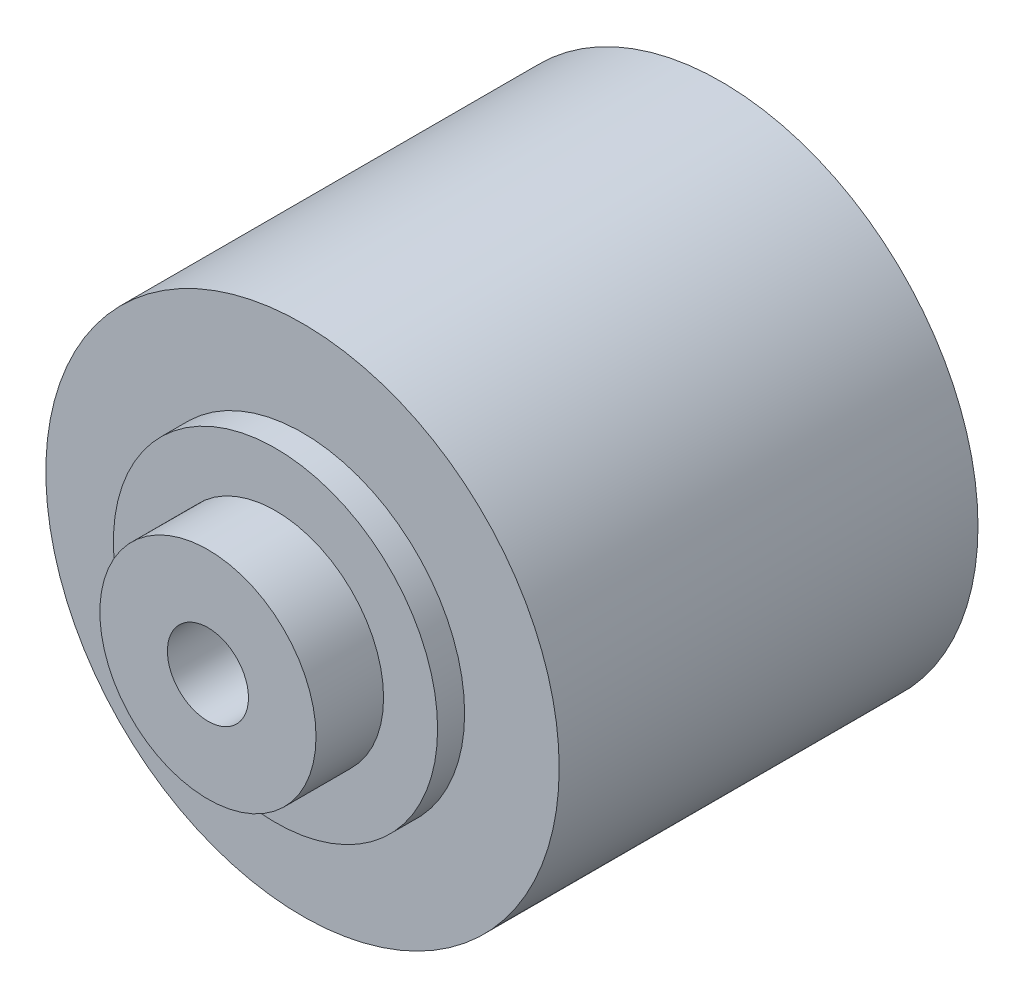
ISO-10303-21;
HEADER;
FILE_DESCRIPTION(('STEP AP214'),'2;1');
FILE_NAME('part.step','',(''),(''),'','','');
FILE_SCHEMA(('AUTOMOTIVE_DESIGN { 1 0 10303 214 1 1 1 1 }'));
ENDSEC;
DATA;
#1=APPLICATION_CONTEXT('core data for automotive mechanical design processes');
#2=APPLICATION_PROTOCOL_DEFINITION('international standard','automotive_design',2000,#1);
#3=PRODUCT_CONTEXT('',#1,'mechanical');
#4=PRODUCT('Part','Part','',(#3));
#5=PRODUCT_RELATED_PRODUCT_CATEGORY('part','',(#4));
#6=PRODUCT_DEFINITION_FORMATION('','',#4);
#7=PRODUCT_DEFINITION_CONTEXT('part definition',#1,'design');
#8=PRODUCT_DEFINITION('design','',#6,#7);
#9=PRODUCT_DEFINITION_SHAPE('','',#8);
#10=(LENGTH_UNIT() NAMED_UNIT(*) SI_UNIT(.MILLI.,.METRE.));
#11=(NAMED_UNIT(*) PLANE_ANGLE_UNIT() SI_UNIT($,.RADIAN.));
#12=(NAMED_UNIT(*) SI_UNIT($,.STERADIAN.) SOLID_ANGLE_UNIT());
#13=UNCERTAINTY_MEASURE_WITH_UNIT(LENGTH_MEASURE(1.E-05),#10,'distance_accuracy_value','');
#14=(GEOMETRIC_REPRESENTATION_CONTEXT(3) GLOBAL_UNCERTAINTY_ASSIGNED_CONTEXT((#13)) GLOBAL_UNIT_ASSIGNED_CONTEXT((#10,
#11,#12)) REPRESENTATION_CONTEXT('',''));
#15=CARTESIAN_POINT('',(0.,0.,0.));
#16=DIRECTION('',(0.,0.,1.));
#17=DIRECTION('',(1.,0.,0.));
#18=AXIS2_PLACEMENT_3D('',#15,#16,#17);
#19=CARTESIAN_POINT('',(0.,0.,0.));
#20=DIRECTION('',(0.,0.,1.));
#21=DIRECTION('',(1.,0.,0.));
#22=AXIS2_PLACEMENT_3D('',#19,#20,#21);
#23=PLANE('',#22);
#24=CARTESIAN_POINT('',(0.,0.,0.));
#25=DIRECTION('',(0.,0.,1.));
#26=DIRECTION('',(1.,0.,0.));
#27=AXIS2_PLACEMENT_3D('',#24,#25,#26);
#28=CIRCLE('',#27,19.);
#29=CARTESIAN_POINT('',(19.,0.,0.));
#30=VERTEX_POINT('',#29);
#31=EDGE_CURVE('E48',#30,#30,#28,.T.);
#32=ORIENTED_EDGE('',*,*,#31,.F.);
#33=EDGE_LOOP('',(#32));
#34=FACE_BOUND('',#33,.T.);
#35=CARTESIAN_POINT('',(0.,0.,0.));
#36=DIRECTION('',(0.,0.,1.));
#37=DIRECTION('',(1.,0.,0.));
#38=AXIS2_PLACEMENT_3D('',#35,#36,#37);
#39=CIRCLE('',#38,10.);
#40=CARTESIAN_POINT('',(10.,0.,0.));
#41=VERTEX_POINT('',#40);
#42=EDGE_CURVE('E10',#41,#41,#39,.F.);
#43=ORIENTED_EDGE('',*,*,#42,.F.);
#44=EDGE_LOOP('',(#43));
#45=FACE_BOUND('',#44,.T.);
#46=ADVANCED_FACE('F32',(#34,#45),#23,.F.);
#47=CARTESIAN_POINT('',(0.,0.,31.));
#48=DIRECTION('',(0.,0.,-1.));
#49=DIRECTION('',(-1.,0.,0.));
#50=AXIS2_PLACEMENT_3D('',#47,#48,#49);
#51=CYLINDRICAL_SURFACE('',#50,19.);
#52=CARTESIAN_POINT('',(0.,0.,31.));
#53=DIRECTION('',(0.,0.,1.));
#54=DIRECTION('',(1.,0.,0.));
#55=AXIS2_PLACEMENT_3D('',#52,#53,#54);
#56=CIRCLE('',#55,19.);
#57=CARTESIAN_POINT('',(19.,0.,31.));
#58=VERTEX_POINT('',#57);
#59=EDGE_CURVE('E43',#58,#58,#56,.T.);
#60=ORIENTED_EDGE('',*,*,#59,.F.);
#61=EDGE_LOOP('',(#60));
#62=FACE_BOUND('',#61,.T.);
#63=ORIENTED_EDGE('',*,*,#31,.T.);
#64=EDGE_LOOP('',(#63));
#65=FACE_BOUND('',#64,.T.);
#66=ADVANCED_FACE('F34',(#62,#65),#51,.T.);
#67=CARTESIAN_POINT('',(0.,0.,31.));
#68=DIRECTION('',(0.,0.,1.));
#69=DIRECTION('',(1.,0.,0.));
#70=AXIS2_PLACEMENT_3D('',#67,#68,#69);
#71=PLANE('',#70);
#72=CARTESIAN_POINT('',(0.,0.,31.));
#73=DIRECTION('',(0.,0.,1.));
#74=DIRECTION('',(1.,0.,0.));
#75=AXIS2_PLACEMENT_3D('',#72,#73,#74);
#76=CIRCLE('',#75,12.);
#77=CARTESIAN_POINT('',(12.,0.,31.));
#78=VERTEX_POINT('',#77);
#79=EDGE_CURVE('E61',#78,#78,#76,.T.);
#80=ORIENTED_EDGE('',*,*,#79,.F.);
#81=EDGE_LOOP('',(#80));
#82=FACE_BOUND('',#81,.T.);
#83=ORIENTED_EDGE('',*,*,#59,.T.);
#84=EDGE_LOOP('',(#83));
#85=FACE_BOUND('',#84,.T.);
#86=ADVANCED_FACE('F86',(#82,#85),#71,.T.);
#87=CARTESIAN_POINT('',(0.,0.,33.));
#88=DIRECTION('',(0.,0.,1.));
#89=DIRECTION('',(1.,0.,0.));
#90=AXIS2_PLACEMENT_3D('',#87,#88,#89);
#91=PLANE('',#90);
#92=CARTESIAN_POINT('',(0.,0.,33.));
#93=DIRECTION('',(0.,0.,1.));
#94=DIRECTION('',(1.,0.,0.));
#95=AXIS2_PLACEMENT_3D('',#92,#93,#94);
#96=CIRCLE('',#95,12.);
#97=CARTESIAN_POINT('',(12.,0.,33.));
#98=VERTEX_POINT('',#97);
#99=EDGE_CURVE('E54',#98,#98,#96,.T.);
#100=ORIENTED_EDGE('',*,*,#99,.T.);
#101=EDGE_LOOP('',(#100));
#102=FACE_BOUND('',#101,.T.);
#103=CARTESIAN_POINT('',(0.,0.,33.));
#104=DIRECTION('',(0.,0.,1.));
#105=DIRECTION('',(1.,0.,0.));
#106=AXIS2_PLACEMENT_3D('',#103,#104,#105);
#107=CIRCLE('',#106,8.);
#108=CARTESIAN_POINT('',(8.,0.,33.));
#109=VERTEX_POINT('',#108);
#110=EDGE_CURVE('E53',#109,#109,#107,.T.);
#111=ORIENTED_EDGE('',*,*,#110,.F.);
#112=EDGE_LOOP('',(#111));
#113=FACE_BOUND('',#112,.T.);
#114=ADVANCED_FACE('F91',(#102,#113),#91,.T.);
#115=CARTESIAN_POINT('',(0.,0.,33.));
#116=DIRECTION('',(0.,0.,-1.));
#117=DIRECTION('',(-1.,0.,0.));
#118=AXIS2_PLACEMENT_3D('',#115,#116,#117);
#119=CYLINDRICAL_SURFACE('',#118,12.);
#120=ORIENTED_EDGE('',*,*,#99,.F.);
#121=EDGE_LOOP('',(#120));
#122=FACE_BOUND('',#121,.T.);
#123=ORIENTED_EDGE('',*,*,#79,.T.);
#124=EDGE_LOOP('',(#123));
#125=FACE_BOUND('',#124,.T.);
#126=ADVANCED_FACE('F97',(#122,#125),#119,.T.);
#127=CARTESIAN_POINT('',(0.,0.,38.));
#128=DIRECTION('',(0.,0.,-1.));
#129=DIRECTION('',(-1.,0.,0.));
#130=AXIS2_PLACEMENT_3D('',#127,#128,#129);
#131=CYLINDRICAL_SURFACE('',#130,8.);
#132=ORIENTED_EDGE('',*,*,#110,.T.);
#133=EDGE_LOOP('',(#132));
#134=FACE_BOUND('',#133,.T.);
#135=CARTESIAN_POINT('',(0.,0.,38.));
#136=DIRECTION('',(0.,0.,1.));
#137=DIRECTION('',(1.,0.,0.));
#138=AXIS2_PLACEMENT_3D('',#135,#136,#137);
#139=CIRCLE('',#138,8.);
#140=CARTESIAN_POINT('',(8.,0.,38.));
#141=VERTEX_POINT('',#140);
#142=EDGE_CURVE('E73',#141,#141,#139,.T.);
#143=ORIENTED_EDGE('',*,*,#142,.F.);
#144=EDGE_LOOP('',(#143));
#145=FACE_BOUND('',#144,.T.);
#146=ADVANCED_FACE('F93',(#134,#145),#131,.T.);
#147=CARTESIAN_POINT('',(0.,0.,38.));
#148=DIRECTION('',(0.,0.,1.));
#149=DIRECTION('',(1.,0.,0.));
#150=AXIS2_PLACEMENT_3D('',#147,#148,#149);
#151=PLANE('',#150);
#152=CARTESIAN_POINT('',(0.,0.,38.));
#153=DIRECTION('',(0.,0.,1.));
#154=DIRECTION('',(1.,0.,0.));
#155=AXIS2_PLACEMENT_3D('',#152,#153,#154);
#156=CIRCLE('',#155,3.);
#157=CARTESIAN_POINT('',(3.,0.,38.));
#158=VERTEX_POINT('',#157);
#159=EDGE_CURVE('E58',#158,#158,#156,.T.);
#160=ORIENTED_EDGE('',*,*,#159,.F.);
#161=EDGE_LOOP('',(#160));
#162=FACE_BOUND('',#161,.T.);
#163=ORIENTED_EDGE('',*,*,#142,.T.);
#164=EDGE_LOOP('',(#163));
#165=FACE_BOUND('',#164,.T.);
#166=ADVANCED_FACE('F96',(#162,#165),#151,.T.);
#167=CARTESIAN_POINT('',(0.,0.,0.));
#168=DIRECTION('',(0.,0.,1.));
#169=DIRECTION('',(1.,0.,0.));
#170=AXIS2_PLACEMENT_3D('',#167,#168,#169);
#171=CYLINDRICAL_SURFACE('',#170,3.);
#172=CARTESIAN_POINT('',(0.,0.,33.));
#173=DIRECTION('',(0.,0.,1.));
#174=DIRECTION('',(1.,0.,0.));
#175=AXIS2_PLACEMENT_3D('',#172,#173,#174);
#176=CIRCLE('',#175,3.);
#177=CARTESIAN_POINT('',(3.,0.,33.));
#178=VERTEX_POINT('',#177);
#179=EDGE_CURVE('E51',#178,#178,#176,.F.);
#180=ORIENTED_EDGE('',*,*,#179,.T.);
#181=EDGE_LOOP('',(#180));
#182=FACE_BOUND('',#181,.T.);
#183=ORIENTED_EDGE('',*,*,#159,.T.);
#184=EDGE_LOOP('',(#183));
#185=FACE_BOUND('',#184,.T.);
#186=ADVANCED_FACE('F101',(#182,#185),#171,.F.);
#187=ORIENTED_EDGE('',*,*,#179,.F.);
#188=EDGE_LOOP('',(#187));
#189=FACE_BOUND('',#188,.T.);
#190=ADVANCED_FACE('F105',(#189),#91,.T.);
#191=CARTESIAN_POINT('',(0.,0.,-1.));
#192=DIRECTION('',(0.,0.,-1.));
#193=DIRECTION('',(-1.,0.,0.));
#194=AXIS2_PLACEMENT_3D('',#191,#192,#193);
#195=PLANE('',#194);
#196=CARTESIAN_POINT('',(0.,0.,-1.));
#197=DIRECTION('',(0.,0.,-1.));
#198=DIRECTION('',(-1.,0.,0.));
#199=AXIS2_PLACEMENT_3D('',#196,#197,#198);
#200=CIRCLE('',#199,10.);
#201=CARTESIAN_POINT('',(-10.,0.,-1.));
#202=VERTEX_POINT('',#201);
#203=EDGE_CURVE('E66',#202,#202,#200,.T.);
#204=ORIENTED_EDGE('',*,*,#203,.T.);
#205=EDGE_LOOP('',(#204));
#206=FACE_BOUND('',#205,.T.);
#207=CARTESIAN_POINT('',(0.,0.,-1.));
#208=DIRECTION('',(0.,0.,-1.));
#209=DIRECTION('',(-1.,0.,0.));
#210=AXIS2_PLACEMENT_3D('',#207,#208,#209);
#211=CIRCLE('',#210,3.);
#212=CARTESIAN_POINT('',(-3.,0.,-1.));
#213=VERTEX_POINT('',#212);
#214=EDGE_CURVE('E131',#213,#213,#211,.T.);
#215=ORIENTED_EDGE('',*,*,#214,.F.);
#216=EDGE_LOOP('',(#215));
#217=FACE_BOUND('',#216,.T.);
#218=ADVANCED_FACE('F118',(#206,#217),#195,.T.);
#219=CARTESIAN_POINT('',(0.,0.,-1.));
#220=DIRECTION('',(0.,0.,1.));
#221=DIRECTION('',(1.,0.,0.));
#222=AXIS2_PLACEMENT_3D('',#219,#220,#221);
#223=CYLINDRICAL_SURFACE('',#222,10.);
#224=ORIENTED_EDGE('',*,*,#203,.F.);
#225=EDGE_LOOP('',(#224));
#226=FACE_BOUND('',#225,.T.);
#227=ORIENTED_EDGE('',*,*,#42,.T.);
#228=EDGE_LOOP('',(#227));
#229=FACE_BOUND('',#228,.T.);
#230=ADVANCED_FACE('F113',(#226,#229),#223,.T.);
#231=CARTESIAN_POINT('',(0.,0.,31.));
#232=DIRECTION('',(0.,0.,1.));
#233=DIRECTION('',(1.,0.,0.));
#234=AXIS2_PLACEMENT_3D('',#231,#232,#233);
#235=PLANE('',#234);
#236=CARTESIAN_POINT('',(0.,0.,31.));
#237=DIRECTION('',(0.,0.,1.));
#238=DIRECTION('',(1.,0.,0.));
#239=AXIS2_PLACEMENT_3D('',#236,#237,#238);
#240=CIRCLE('',#239,3.);
#241=CARTESIAN_POINT('',(3.,0.,31.));
#242=VERTEX_POINT('',#241);
#243=EDGE_CURVE('E39',#242,#242,#240,.F.);
#244=ORIENTED_EDGE('',*,*,#243,.T.);
#245=EDGE_LOOP('',(#244));
#246=FACE_BOUND('',#245,.T.);
#247=ADVANCED_FACE('F110',(#246),#235,.F.);
#248=ORIENTED_EDGE('',*,*,#243,.F.);
#249=EDGE_LOOP('',(#248));
#250=FACE_BOUND('',#249,.T.);
#251=ORIENTED_EDGE('',*,*,#214,.T.);
#252=EDGE_LOOP('',(#251));
#253=FACE_BOUND('',#252,.T.);
#254=ADVANCED_FACE('F106',(#250,#253),#171,.F.);
#255=CLOSED_SHELL('',(#46,#66,#86,#114,#126,#146,#166,#186,#190,#218,#230,#247,#254));
#256=MANIFOLD_SOLID_BREP('B2',#255);
#257=ADVANCED_BREP_SHAPE_REPRESENTATION('',(#18,#256),#14);
#258=SHAPE_DEFINITION_REPRESENTATION(#9,#257);
ENDSEC;
END-ISO-10303-21;
